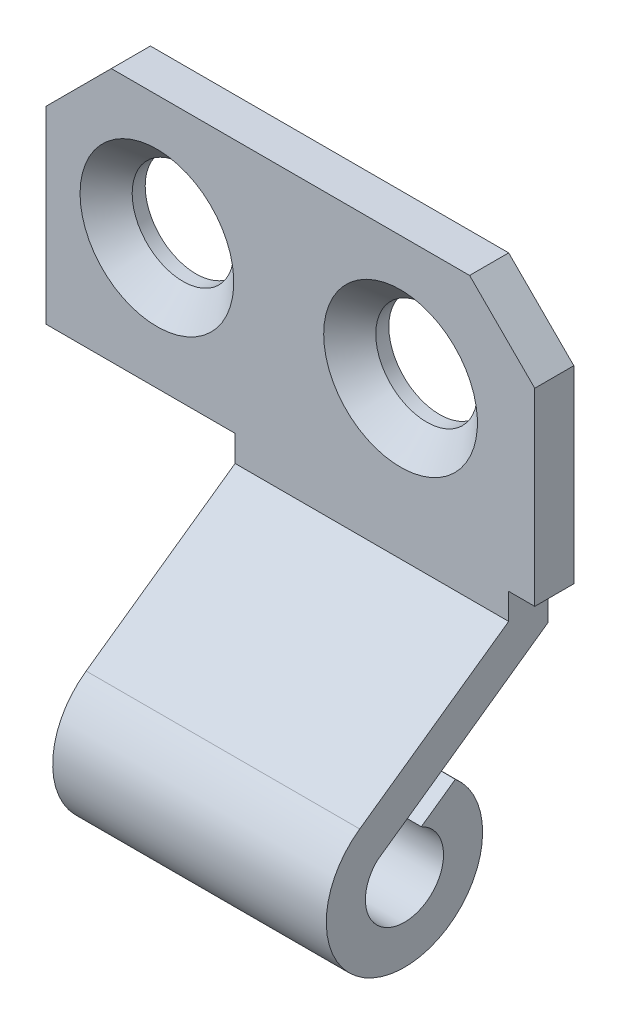
ISO-10303-21;
HEADER;
FILE_DESCRIPTION(('STEP AP214'),'2;1');
FILE_NAME('part.step','',(''),(''),'','','');
FILE_SCHEMA(('AUTOMOTIVE_DESIGN { 1 0 10303 214 1 1 1 1 }'));
ENDSEC;
DATA;
#1=APPLICATION_CONTEXT('core data for automotive mechanical design processes');
#2=APPLICATION_PROTOCOL_DEFINITION('international standard','automotive_design',2000,#1);
#3=PRODUCT_CONTEXT('',#1,'mechanical');
#4=PRODUCT('Part','Part','',(#3));
#5=PRODUCT_RELATED_PRODUCT_CATEGORY('part','',(#4));
#6=PRODUCT_DEFINITION_FORMATION('','',#4);
#7=PRODUCT_DEFINITION_CONTEXT('part definition',#1,'design');
#8=PRODUCT_DEFINITION('design','',#6,#7);
#9=PRODUCT_DEFINITION_SHAPE('','',#8);
#10=(LENGTH_UNIT() NAMED_UNIT(*) SI_UNIT(.MILLI.,.METRE.));
#11=(NAMED_UNIT(*) PLANE_ANGLE_UNIT() SI_UNIT($,.RADIAN.));
#12=(NAMED_UNIT(*) SI_UNIT($,.STERADIAN.) SOLID_ANGLE_UNIT());
#13=UNCERTAINTY_MEASURE_WITH_UNIT(LENGTH_MEASURE(1.E-05),#10,'distance_accuracy_value','');
#14=(GEOMETRIC_REPRESENTATION_CONTEXT(3) GLOBAL_UNCERTAINTY_ASSIGNED_CONTEXT((#13)) GLOBAL_UNIT_ASSIGNED_CONTEXT((#10,
#11,#12)) REPRESENTATION_CONTEXT('',''));
#15=CARTESIAN_POINT('',(0.,0.,0.));
#16=DIRECTION('',(0.,0.,1.));
#17=DIRECTION('',(1.,0.,0.));
#18=AXIS2_PLACEMENT_3D('',#15,#16,#17);
#19=CARTESIAN_POINT('',(0.,0.,3.));
#20=DIRECTION('',(0.,0.,-1.));
#21=DIRECTION('',(-1.,0.,0.));
#22=AXIS2_PLACEMENT_3D('',#19,#20,#21);
#23=PLANE('',#22);
#24=CARTESIAN_POINT('',(-10.25,0.25,3.));
#25=DIRECTION('',(0.,0.,-1.));
#26=DIRECTION('',(-1.,0.,0.));
#27=AXIS2_PLACEMENT_3D('',#24,#25,#26);
#28=CIRCLE('',#27,5.90000000000001);
#29=CARTESIAN_POINT('',(-16.15,0.25,3.));
#30=VERTEX_POINT('',#29);
#31=EDGE_CURVE('E42',#30,#30,#28,.T.);
#32=ORIENTED_EDGE('',*,*,#31,.T.);
#33=EDGE_LOOP('',(#32));
#34=FACE_BOUND('',#33,.T.);
#35=CARTESIAN_POINT('',(8.45,0.25,3.));
#36=DIRECTION('',(0.,0.,-1.));
#37=DIRECTION('',(-1.,0.,0.));
#38=AXIS2_PLACEMENT_3D('',#35,#36,#37);
#39=CIRCLE('',#38,5.90000000000001);
#40=CARTESIAN_POINT('',(2.54999999999999,0.25,3.));
#41=VERTEX_POINT('',#40);
#42=EDGE_CURVE('E231',#41,#41,#39,.T.);
#43=ORIENTED_EDGE('',*,*,#42,.T.);
#44=EDGE_LOOP('',(#43));
#45=FACE_BOUND('',#44,.T.);
#46=DIRECTION('',(1.,0.,0.));
#47=VECTOR('',#46,1.);
#48=CARTESIAN_POINT('',(16.75,-9.75,3.));
#49=LINE('',#48,#47);
#50=CARTESIAN_POINT('',(16.75,-9.75,3.));
#51=VERTEX_POINT('',#50);
#52=CARTESIAN_POINT('',(18.75,-9.75,3.));
#53=VERTEX_POINT('',#52);
#54=EDGE_CURVE('E179',#51,#53,#49,.T.);
#55=ORIENTED_EDGE('',*,*,#54,.T.);
#56=DIRECTION('',(0.,1.,0.));
#57=VECTOR('',#56,1.);
#58=CARTESIAN_POINT('',(18.75,4.75,3.));
#59=LINE('',#58,#57);
#60=CARTESIAN_POINT('',(18.75,4.75,3.));
#61=VERTEX_POINT('',#60);
#62=EDGE_CURVE('E96',#53,#61,#59,.T.);
#63=ORIENTED_EDGE('',*,*,#62,.T.);
#64=DIRECTION('',(-0.707106781186548,0.707106781186547,0.));
#65=VECTOR('',#64,1.);
#66=CARTESIAN_POINT('',(13.75,9.75,3.));
#67=LINE('',#66,#65);
#68=CARTESIAN_POINT('',(13.75,9.75,3.));
#69=VERTEX_POINT('',#68);
#70=EDGE_CURVE('E182',#61,#69,#67,.T.);
#71=ORIENTED_EDGE('',*,*,#70,.T.);
#72=DIRECTION('',(-1.,0.,0.));
#73=VECTOR('',#72,1.);
#74=CARTESIAN_POINT('',(-13.75,9.75,3.));
#75=LINE('',#74,#73);
#76=CARTESIAN_POINT('',(-13.75,9.75,3.));
#77=VERTEX_POINT('',#76);
#78=EDGE_CURVE('E184',#69,#77,#75,.T.);
#79=ORIENTED_EDGE('',*,*,#78,.T.);
#80=DIRECTION('',(-0.707106781186548,-0.707106781186547,0.));
#81=VECTOR('',#80,1.);
#82=CARTESIAN_POINT('',(-13.75,9.75,3.));
#83=LINE('',#82,#81);
#84=CARTESIAN_POINT('',(-18.75,4.75,3.));
#85=VERTEX_POINT('',#84);
#86=EDGE_CURVE('E186',#77,#85,#83,.T.);
#87=ORIENTED_EDGE('',*,*,#86,.T.);
#88=DIRECTION('',(0.,-1.,0.));
#89=VECTOR('',#88,1.);
#90=CARTESIAN_POINT('',(-18.75,4.75,3.));
#91=LINE('',#90,#89);
#92=CARTESIAN_POINT('',(-18.75,-9.75,3.));
#93=VERTEX_POINT('',#92);
#94=EDGE_CURVE('E188',#85,#93,#91,.T.);
#95=ORIENTED_EDGE('',*,*,#94,.T.);
#96=DIRECTION('',(1.,0.,0.));
#97=VECTOR('',#96,1.);
#98=CARTESIAN_POINT('',(-18.75,-9.75,3.));
#99=LINE('',#98,#97);
#100=CARTESIAN_POINT('',(-4.25,-9.75,3.));
#101=VERTEX_POINT('',#100);
#102=EDGE_CURVE('E121',#93,#101,#99,.T.);
#103=ORIENTED_EDGE('',*,*,#102,.T.);
#104=DIRECTION('',(0.,-1.,0.));
#105=VECTOR('',#104,1.);
#106=CARTESIAN_POINT('',(-4.25,-9.75,3.));
#107=LINE('',#106,#105);
#108=CARTESIAN_POINT('',(-4.25,-11.75,3.));
#109=VERTEX_POINT('',#108);
#110=EDGE_CURVE('E117',#101,#109,#107,.T.);
#111=ORIENTED_EDGE('',*,*,#110,.T.);
#112=DIRECTION('',(1.,0.,0.));
#113=VECTOR('',#112,1.);
#114=CARTESIAN_POINT('',(-4.25,-11.75,3.));
#115=LINE('',#114,#113);
#116=CARTESIAN_POINT('',(16.75,-11.75,3.));
#117=VERTEX_POINT('',#116);
#118=EDGE_CURVE('E119',#109,#117,#115,.T.);
#119=ORIENTED_EDGE('',*,*,#118,.T.);
#120=DIRECTION('',(0.,1.,0.));
#121=VECTOR('',#120,1.);
#122=CARTESIAN_POINT('',(16.75,-9.75,3.));
#123=LINE('',#122,#121);
#124=EDGE_CURVE('E50',#117,#51,#123,.T.);
#125=ORIENTED_EDGE('',*,*,#124,.T.);
#126=EDGE_LOOP('',(#55,#63,#71,#79,#87,#95,#103,#111,#119,#125));
#127=FACE_BOUND('',#126,.T.);
#128=ADVANCED_FACE('F33',(#34,#45,#127),#23,.F.);
#129=CARTESIAN_POINT('',(0.,0.,0.));
#130=DIRECTION('',(0.,0.,-1.));
#131=DIRECTION('',(-1.,0.,0.));
#132=AXIS2_PLACEMENT_3D('',#129,#130,#131);
#133=PLANE('',#132);
#134=CARTESIAN_POINT('',(8.45,0.25,0.));
#135=DIRECTION('',(0.,0.,1.));
#136=DIRECTION('',(1.,0.,0.));
#137=AXIS2_PLACEMENT_3D('',#134,#135,#136);
#138=CIRCLE('',#137,3.9);
#139=CARTESIAN_POINT('',(12.35,0.25,0.));
#140=VERTEX_POINT('',#139);
#141=EDGE_CURVE('E175',#140,#140,#138,.T.);
#142=ORIENTED_EDGE('',*,*,#141,.T.);
#143=EDGE_LOOP('',(#142));
#144=FACE_BOUND('',#143,.T.);
#145=DIRECTION('',(1.,0.,0.));
#146=VECTOR('',#145,1.);
#147=CARTESIAN_POINT('',(16.75,-9.75,0.));
#148=LINE('',#147,#146);
#149=CARTESIAN_POINT('',(16.75,-9.75,0.));
#150=VERTEX_POINT('',#149);
#151=CARTESIAN_POINT('',(18.75,-9.75,0.));
#152=VERTEX_POINT('',#151);
#153=EDGE_CURVE('E178',#150,#152,#148,.T.);
#154=ORIENTED_EDGE('',*,*,#153,.F.);
#155=DIRECTION('',(0.,1.,0.));
#156=VECTOR('',#155,1.);
#157=CARTESIAN_POINT('',(16.75,-9.75,0.));
#158=LINE('',#157,#156);
#159=CARTESIAN_POINT('',(16.75,-13.3486434125533,0.));
#160=VERTEX_POINT('',#159);
#161=EDGE_CURVE('E87',#160,#150,#158,.T.);
#162=ORIENTED_EDGE('',*,*,#161,.F.);
#163=DIRECTION('',(1.,0.,0.));
#164=VECTOR('',#163,1.);
#165=CARTESIAN_POINT('',(-4.25,-13.3486434125533,0.));
#166=LINE('',#165,#164);
#167=CARTESIAN_POINT('',(-4.25,-13.3486434125533,0.));
#168=VERTEX_POINT('',#167);
#169=EDGE_CURVE('E159',#168,#160,#166,.T.);
#170=ORIENTED_EDGE('',*,*,#169,.F.);
#171=DIRECTION('',(0.,-1.,0.));
#172=VECTOR('',#171,1.);
#173=CARTESIAN_POINT('',(-4.25,-9.75,0.));
#174=LINE('',#173,#172);
#175=CARTESIAN_POINT('',(-4.25,-9.75,0.));
#176=VERTEX_POINT('',#175);
#177=EDGE_CURVE('E206',#176,#168,#174,.T.);
#178=ORIENTED_EDGE('',*,*,#177,.F.);
#179=DIRECTION('',(1.,0.,0.));
#180=VECTOR('',#179,1.);
#181=CARTESIAN_POINT('',(-18.75,-9.75,0.));
#182=LINE('',#181,#180);
#183=CARTESIAN_POINT('',(-18.75,-9.75,0.));
#184=VERTEX_POINT('',#183);
#185=EDGE_CURVE('E80',#184,#176,#182,.T.);
#186=ORIENTED_EDGE('',*,*,#185,.F.);
#187=DIRECTION('',(0.,-1.,0.));
#188=VECTOR('',#187,1.);
#189=CARTESIAN_POINT('',(-18.75,4.75,0.));
#190=LINE('',#189,#188);
#191=CARTESIAN_POINT('',(-18.75,4.75,0.));
#192=VERTEX_POINT('',#191);
#193=EDGE_CURVE('E203',#192,#184,#190,.T.);
#194=ORIENTED_EDGE('',*,*,#193,.F.);
#195=DIRECTION('',(-0.707106781186548,-0.707106781186547,0.));
#196=VECTOR('',#195,1.);
#197=CARTESIAN_POINT('',(-13.75,9.75,0.));
#198=LINE('',#197,#196);
#199=CARTESIAN_POINT('',(-13.75,9.75,0.));
#200=VERTEX_POINT('',#199);
#201=EDGE_CURVE('E201',#200,#192,#198,.T.);
#202=ORIENTED_EDGE('',*,*,#201,.F.);
#203=DIRECTION('',(-1.,0.,0.));
#204=VECTOR('',#203,1.);
#205=CARTESIAN_POINT('',(-13.75,9.75,0.));
#206=LINE('',#205,#204);
#207=CARTESIAN_POINT('',(13.75,9.75,0.));
#208=VERTEX_POINT('',#207);
#209=EDGE_CURVE('E199',#208,#200,#206,.T.);
#210=ORIENTED_EDGE('',*,*,#209,.F.);
#211=DIRECTION('',(-0.707106781186548,0.707106781186547,0.));
#212=VECTOR('',#211,1.);
#213=CARTESIAN_POINT('',(13.75,9.75,0.));
#214=LINE('',#213,#212);
#215=CARTESIAN_POINT('',(18.75,4.75,0.));
#216=VERTEX_POINT('',#215);
#217=EDGE_CURVE('E197',#216,#208,#214,.T.);
#218=ORIENTED_EDGE('',*,*,#217,.F.);
#219=DIRECTION('',(0.,1.,0.));
#220=VECTOR('',#219,1.);
#221=CARTESIAN_POINT('',(18.75,4.75,0.));
#222=LINE('',#221,#220);
#223=EDGE_CURVE('E195',#152,#216,#222,.T.);
#224=ORIENTED_EDGE('',*,*,#223,.F.);
#225=EDGE_LOOP('',(#154,#162,#170,#178,#186,#194,#202,#210,#218,#224));
#226=FACE_BOUND('',#225,.T.);
#227=CARTESIAN_POINT('',(-10.25,0.25,0.));
#228=DIRECTION('',(0.,0.,1.));
#229=DIRECTION('',(1.,0.,0.));
#230=AXIS2_PLACEMENT_3D('',#227,#228,#229);
#231=CIRCLE('',#230,3.9);
#232=CARTESIAN_POINT('',(-6.34999999999999,0.25,0.));
#233=VERTEX_POINT('',#232);
#234=EDGE_CURVE('E162',#233,#233,#231,.T.);
#235=ORIENTED_EDGE('',*,*,#234,.T.);
#236=EDGE_LOOP('',(#235));
#237=FACE_BOUND('',#236,.T.);
#238=ADVANCED_FACE('F250',(#144,#226,#237),#133,.T.);
#239=CARTESIAN_POINT('',(16.75,-9.75,3.));
#240=DIRECTION('',(0.,1.,0.));
#241=DIRECTION('',(0.,0.,1.));
#242=AXIS2_PLACEMENT_3D('',#239,#240,#241);
#243=PLANE('',#242);
#244=ORIENTED_EDGE('',*,*,#153,.T.);
#245=DIRECTION('',(0.,0.,-1.));
#246=VECTOR('',#245,1.);
#247=CARTESIAN_POINT('',(18.75,-9.75,3.));
#248=LINE('',#247,#246);
#249=EDGE_CURVE('E226',#53,#152,#248,.T.);
#250=ORIENTED_EDGE('',*,*,#249,.F.);
#251=ORIENTED_EDGE('',*,*,#54,.F.);
#252=DIRECTION('',(0.,0.,-1.));
#253=VECTOR('',#252,1.);
#254=CARTESIAN_POINT('',(16.75,-9.75,3.));
#255=LINE('',#254,#253);
#256=EDGE_CURVE('E192',#51,#150,#255,.T.);
#257=ORIENTED_EDGE('',*,*,#256,.T.);
#258=EDGE_LOOP('',(#244,#250,#251,#257));
#259=FACE_BOUND('',#258,.T.);
#260=ADVANCED_FACE('F252',(#259),#243,.F.);
#261=CARTESIAN_POINT('',(18.75,4.75,3.));
#262=DIRECTION('',(-1.,0.,0.));
#263=DIRECTION('',(0.,-1.,0.));
#264=AXIS2_PLACEMENT_3D('',#261,#262,#263);
#265=PLANE('',#264);
#266=ORIENTED_EDGE('',*,*,#223,.T.);
#267=DIRECTION('',(0.,0.,-1.));
#268=VECTOR('',#267,1.);
#269=CARTESIAN_POINT('',(18.75,4.75,3.));
#270=LINE('',#269,#268);
#271=EDGE_CURVE('E223',#61,#216,#270,.T.);
#272=ORIENTED_EDGE('',*,*,#271,.F.);
#273=ORIENTED_EDGE('',*,*,#62,.F.);
#274=ORIENTED_EDGE('',*,*,#249,.T.);
#275=EDGE_LOOP('',(#266,#272,#273,#274));
#276=FACE_BOUND('',#275,.T.);
#277=ADVANCED_FACE('F259',(#276),#265,.F.);
#278=CARTESIAN_POINT('',(13.75,9.75,3.));
#279=DIRECTION('',(-0.707106781186547,-0.707106781186548,0.));
#280=DIRECTION('',(0.707106781186548,-0.707106781186547,0.));
#281=AXIS2_PLACEMENT_3D('',#278,#279,#280);
#282=PLANE('',#281);
#283=ORIENTED_EDGE('',*,*,#217,.T.);
#284=DIRECTION('',(0.,0.,-1.));
#285=VECTOR('',#284,1.);
#286=CARTESIAN_POINT('',(13.75,9.75,3.));
#287=LINE('',#286,#285);
#288=EDGE_CURVE('E220',#69,#208,#287,.T.);
#289=ORIENTED_EDGE('',*,*,#288,.F.);
#290=ORIENTED_EDGE('',*,*,#70,.F.);
#291=ORIENTED_EDGE('',*,*,#271,.T.);
#292=EDGE_LOOP('',(#283,#289,#290,#291));
#293=FACE_BOUND('',#292,.T.);
#294=ADVANCED_FACE('F285',(#293),#282,.F.);
#295=CARTESIAN_POINT('',(-13.75,9.75,3.));
#296=DIRECTION('',(0.,-1.,0.));
#297=DIRECTION('',(0.,0.,-1.));
#298=AXIS2_PLACEMENT_3D('',#295,#296,#297);
#299=PLANE('',#298);
#300=ORIENTED_EDGE('',*,*,#209,.T.);
#301=DIRECTION('',(0.,0.,-1.));
#302=VECTOR('',#301,1.);
#303=CARTESIAN_POINT('',(-13.75,9.75,3.));
#304=LINE('',#303,#302);
#305=EDGE_CURVE('E217',#77,#200,#304,.T.);
#306=ORIENTED_EDGE('',*,*,#305,.F.);
#307=ORIENTED_EDGE('',*,*,#78,.F.);
#308=ORIENTED_EDGE('',*,*,#288,.T.);
#309=EDGE_LOOP('',(#300,#306,#307,#308));
#310=FACE_BOUND('',#309,.T.);
#311=ADVANCED_FACE('F281',(#310),#299,.F.);
#312=CARTESIAN_POINT('',(-13.75,9.75,3.));
#313=DIRECTION('',(0.707106781186547,-0.707106781186548,0.));
#314=DIRECTION('',(0.707106781186548,0.707106781186547,0.));
#315=AXIS2_PLACEMENT_3D('',#312,#313,#314);
#316=PLANE('',#315);
#317=ORIENTED_EDGE('',*,*,#201,.T.);
#318=DIRECTION('',(0.,0.,-1.));
#319=VECTOR('',#318,1.);
#320=CARTESIAN_POINT('',(-18.75,4.75,3.));
#321=LINE('',#320,#319);
#322=EDGE_CURVE('E214',#85,#192,#321,.T.);
#323=ORIENTED_EDGE('',*,*,#322,.F.);
#324=ORIENTED_EDGE('',*,*,#86,.F.);
#325=ORIENTED_EDGE('',*,*,#305,.T.);
#326=EDGE_LOOP('',(#317,#323,#324,#325));
#327=FACE_BOUND('',#326,.T.);
#328=ADVANCED_FACE('F277',(#327),#316,.F.);
#329=CARTESIAN_POINT('',(-18.75,4.75,3.));
#330=DIRECTION('',(1.,0.,0.));
#331=DIRECTION('',(0.,1.,0.));
#332=AXIS2_PLACEMENT_3D('',#329,#330,#331);
#333=PLANE('',#332);
#334=ORIENTED_EDGE('',*,*,#193,.T.);
#335=DIRECTION('',(0.,0.,-1.));
#336=VECTOR('',#335,1.);
#337=CARTESIAN_POINT('',(-18.75,-9.75,3.));
#338=LINE('',#337,#336);
#339=EDGE_CURVE('E212',#93,#184,#338,.T.);
#340=ORIENTED_EDGE('',*,*,#339,.F.);
#341=ORIENTED_EDGE('',*,*,#94,.F.);
#342=ORIENTED_EDGE('',*,*,#322,.T.);
#343=EDGE_LOOP('',(#334,#340,#341,#342));
#344=FACE_BOUND('',#343,.T.);
#345=ADVANCED_FACE('F274',(#344),#333,.F.);
#346=CARTESIAN_POINT('',(-18.75,-9.75,3.));
#347=DIRECTION('',(0.,1.,0.));
#348=DIRECTION('',(0.,0.,1.));
#349=AXIS2_PLACEMENT_3D('',#346,#347,#348);
#350=PLANE('',#349);
#351=ORIENTED_EDGE('',*,*,#185,.T.);
#352=DIRECTION('',(0.,0.,-1.));
#353=VECTOR('',#352,1.);
#354=CARTESIAN_POINT('',(-4.25,-9.75,3.));
#355=LINE('',#354,#353);
#356=EDGE_CURVE('E210',#101,#176,#355,.T.);
#357=ORIENTED_EDGE('',*,*,#356,.F.);
#358=ORIENTED_EDGE('',*,*,#102,.F.);
#359=ORIENTED_EDGE('',*,*,#339,.T.);
#360=EDGE_LOOP('',(#351,#357,#358,#359));
#361=FACE_BOUND('',#360,.T.);
#362=ADVANCED_FACE('F271',(#361),#350,.F.);
#363=CARTESIAN_POINT('',(-4.25,-9.75,3.));
#364=DIRECTION('',(1.,0.,0.));
#365=DIRECTION('',(0.,0.,-1.));
#366=AXIS2_PLACEMENT_3D('',#363,#364,#365);
#367=PLANE('',#366);
#368=ORIENTED_EDGE('',*,*,#177,.T.);
#369=DIRECTION('',(0.,-0.57710358824873,0.8166709548101));
#370=VECTOR('',#369,1.);
#371=CARTESIAN_POINT('',(-4.25,-13.3486434125533,0.));
#372=LINE('',#371,#370);
#373=CARTESIAN_POINT('',(-4.25,-22.6012003334332,13.0934803540903));
#374=VERTEX_POINT('',#373);
#375=EDGE_CURVE('E155',#168,#374,#372,.T.);
#376=ORIENTED_EDGE('',*,*,#375,.T.);
#377=CARTESIAN_POINT('',(-4.25,-24.75,11.));
#378=DIRECTION('',(1.,0.,0.));
#379=DIRECTION('',(0.,0.,-1.));
#380=AXIS2_PLACEMENT_3D('',#377,#378,#379);
#381=CIRCLE('',#380,3.);
#382=CARTESIAN_POINT('',(-4.25,-22.0437157622179,9.70538591683386));
#383=VERTEX_POINT('',#382);
#384=EDGE_CURVE('E152',#374,#383,#381,.T.);
#385=ORIENTED_EDGE('',*,*,#384,.T.);
#386=DIRECTION('',(0.,-0.57710358824873,0.8166709548101));
#387=VECTOR('',#386,1.);
#388=CARTESIAN_POINT('',(-4.25,-20.1970890298532,7.09218709532849));
#389=LINE('',#388,#387);
#390=CARTESIAN_POINT('',(-4.25,-20.1970890298532,7.09218709532849));
#391=VERTEX_POINT('',#390);
#392=EDGE_CURVE('E143',#391,#383,#389,.T.);
#393=ORIENTED_EDGE('',*,*,#392,.F.);
#394=CARTESIAN_POINT('',(-4.25,-24.75,11.));
#395=DIRECTION('',(1.,0.,0.));
#396=DIRECTION('',(0.,0.,-1.));
#397=AXIS2_PLACEMENT_3D('',#394,#395,#396);
#398=CIRCLE('',#397,6.);
#399=CARTESIAN_POINT('',(-4.25,-19.8294502354822,14.4333933673414));
#400=VERTEX_POINT('',#399);
#401=EDGE_CURVE('E140',#400,#391,#398,.T.);
#402=ORIENTED_EDGE('',*,*,#401,.F.);
#403=DIRECTION('',(0.,-0.57710358824873,0.8166709548101));
#404=VECTOR('',#403,1.);
#405=CARTESIAN_POINT('',(-4.25,-11.75,3.));
#406=LINE('',#405,#404);
#407=EDGE_CURVE('E131',#109,#400,#406,.T.);
#408=ORIENTED_EDGE('',*,*,#407,.F.);
#409=ORIENTED_EDGE('',*,*,#110,.F.);
#410=ORIENTED_EDGE('',*,*,#356,.T.);
#411=EDGE_LOOP('',(#368,#376,#385,#393,#402,#408,#409,#410));
#412=FACE_BOUND('',#411,.T.);
#413=ADVANCED_FACE('F137',(#412),#367,.F.);
#414=CARTESIAN_POINT('',(16.75,-9.75,3.));
#415=DIRECTION('',(-1.,0.,0.));
#416=DIRECTION('',(0.,0.,1.));
#417=AXIS2_PLACEMENT_3D('',#414,#415,#416);
#418=PLANE('',#417);
#419=ORIENTED_EDGE('',*,*,#161,.T.);
#420=ORIENTED_EDGE('',*,*,#256,.F.);
#421=ORIENTED_EDGE('',*,*,#124,.F.);
#422=DIRECTION('',(0.,-0.57710358824873,0.8166709548101));
#423=VECTOR('',#422,1.);
#424=CARTESIAN_POINT('',(16.75,-11.75,3.));
#425=LINE('',#424,#423);
#426=CARTESIAN_POINT('',(16.75,-19.8294502354822,14.4333933673414));
#427=VERTEX_POINT('',#426);
#428=EDGE_CURVE('E133',#117,#427,#425,.T.);
#429=ORIENTED_EDGE('',*,*,#428,.T.);
#430=CARTESIAN_POINT('',(16.75,-24.75,11.));
#431=DIRECTION('',(1.,0.,0.));
#432=DIRECTION('',(0.,0.,-1.));
#433=AXIS2_PLACEMENT_3D('',#430,#431,#432);
#434=CIRCLE('',#433,6.);
#435=CARTESIAN_POINT('',(16.75,-20.1970890298532,7.09218709532849));
#436=VERTEX_POINT('',#435);
#437=EDGE_CURVE('E327',#427,#436,#434,.T.);
#438=ORIENTED_EDGE('',*,*,#437,.T.);
#439=DIRECTION('',(0.,-0.57710358824873,0.8166709548101));
#440=VECTOR('',#439,1.);
#441=CARTESIAN_POINT('',(16.75,-20.1970890298532,7.09218709532849));
#442=LINE('',#441,#440);
#443=CARTESIAN_POINT('',(16.75,-22.0437157622179,9.70538591683386));
#444=VERTEX_POINT('',#443);
#445=EDGE_CURVE('E323',#436,#444,#442,.T.);
#446=ORIENTED_EDGE('',*,*,#445,.T.);
#447=CARTESIAN_POINT('',(16.75,-24.75,11.));
#448=DIRECTION('',(1.,0.,0.));
#449=DIRECTION('',(0.,0.,-1.));
#450=AXIS2_PLACEMENT_3D('',#447,#448,#449);
#451=CIRCLE('',#450,3.);
#452=CARTESIAN_POINT('',(16.75,-22.6012003334332,13.0934803540903));
#453=VERTEX_POINT('',#452);
#454=EDGE_CURVE('E146',#453,#444,#451,.T.);
#455=ORIENTED_EDGE('',*,*,#454,.F.);
#456=DIRECTION('',(0.,-0.57710358824873,0.8166709548101));
#457=VECTOR('',#456,1.);
#458=CARTESIAN_POINT('',(16.75,-13.3486434125533,0.));
#459=LINE('',#458,#457);
#460=EDGE_CURVE('E141',#160,#453,#459,.T.);
#461=ORIENTED_EDGE('',*,*,#460,.F.);
#462=EDGE_LOOP('',(#419,#420,#421,#429,#438,#446,#455,#461));
#463=FACE_BOUND('',#462,.T.);
#464=ADVANCED_FACE('F266',(#463),#418,.F.);
#465=CARTESIAN_POINT('',(8.45,0.25,3.));
#466=DIRECTION('',(0.,0.,-1.));
#467=DIRECTION('',(-1.,0.,0.));
#468=AXIS2_PLACEMENT_3D('',#465,#466,#467);
#469=CYLINDRICAL_SURFACE('',#468,3.9);
#470=CARTESIAN_POINT('',(8.45,0.25,1.00000000000001));
#471=DIRECTION('',(0.,0.,-1.));
#472=DIRECTION('',(-1.,0.,0.));
#473=AXIS2_PLACEMENT_3D('',#470,#471,#472);
#474=CIRCLE('',#473,3.9);
#475=CARTESIAN_POINT('',(4.55,0.25,1.00000000000001));
#476=VERTEX_POINT('',#475);
#477=EDGE_CURVE('E11',#476,#476,#474,.F.);
#478=ORIENTED_EDGE('',*,*,#477,.T.);
#479=EDGE_LOOP('',(#478));
#480=FACE_BOUND('',#479,.T.);
#481=ORIENTED_EDGE('',*,*,#141,.F.);
#482=EDGE_LOOP('',(#481));
#483=FACE_BOUND('',#482,.T.);
#484=ADVANCED_FACE('F246',(#480,#483),#469,.F.);
#485=CARTESIAN_POINT('',(-10.25,0.25,3.));
#486=DIRECTION('',(0.,0.,-1.));
#487=DIRECTION('',(-1.,0.,0.));
#488=AXIS2_PLACEMENT_3D('',#485,#486,#487);
#489=CYLINDRICAL_SURFACE('',#488,3.9);
#490=CARTESIAN_POINT('',(-10.25,0.25,1.00000000000001));
#491=DIRECTION('',(0.,0.,-1.));
#492=DIRECTION('',(-1.,0.,0.));
#493=AXIS2_PLACEMENT_3D('',#490,#491,#492);
#494=CIRCLE('',#493,3.9);
#495=CARTESIAN_POINT('',(-14.15,0.25,1.00000000000001));
#496=VERTEX_POINT('',#495);
#497=EDGE_CURVE('E228',#496,#496,#494,.F.);
#498=ORIENTED_EDGE('',*,*,#497,.T.);
#499=EDGE_LOOP('',(#498));
#500=FACE_BOUND('',#499,.T.);
#501=ORIENTED_EDGE('',*,*,#234,.F.);
#502=EDGE_LOOP('',(#501));
#503=FACE_BOUND('',#502,.T.);
#504=ADVANCED_FACE('F241',(#500,#503),#489,.F.);
#505=CARTESIAN_POINT('',(-10.25,0.25,1.00000000000001));
#506=DIRECTION('',(0.,0.,1.));
#507=DIRECTION('',(1.,0.,0.));
#508=AXIS2_PLACEMENT_3D('',#505,#506,#507);
#509=CONICAL_SURFACE('',#508,3.9,0.785398163397452);
#510=ORIENTED_EDGE('',*,*,#31,.F.);
#511=EDGE_LOOP('',(#510));
#512=FACE_BOUND('',#511,.T.);
#513=ORIENTED_EDGE('',*,*,#497,.F.);
#514=EDGE_LOOP('',(#513));
#515=FACE_BOUND('',#514,.T.);
#516=ADVANCED_FACE('F238',(#512,#515),#509,.F.);
#517=CARTESIAN_POINT('',(8.45,0.25,1.00000000000001));
#518=DIRECTION('',(0.,0.,1.));
#519=DIRECTION('',(1.,0.,0.));
#520=AXIS2_PLACEMENT_3D('',#517,#518,#519);
#521=CONICAL_SURFACE('',#520,3.9,0.785398163397452);
#522=ORIENTED_EDGE('',*,*,#42,.F.);
#523=EDGE_LOOP('',(#522));
#524=FACE_BOUND('',#523,.T.);
#525=ORIENTED_EDGE('',*,*,#477,.F.);
#526=EDGE_LOOP('',(#525));
#527=FACE_BOUND('',#526,.T.);
#528=ADVANCED_FACE('F35',(#524,#527),#521,.F.);
#529=CARTESIAN_POINT('',(-4.25,-11.75,3.));
#530=DIRECTION('',(0.,0.8166709548101,0.57710358824873));
#531=DIRECTION('',(0.,-0.57710358824873,0.8166709548101));
#532=AXIS2_PLACEMENT_3D('',#529,#530,#531);
#533=PLANE('',#532);
#534=DIRECTION('',(1.,0.,0.));
#535=VECTOR('',#534,1.);
#536=CARTESIAN_POINT('',(-4.25,-19.8294502354822,14.4333933673414));
#537=LINE('',#536,#535);
#538=EDGE_CURVE('E158',#400,#427,#537,.T.);
#539=ORIENTED_EDGE('',*,*,#538,.T.);
#540=ORIENTED_EDGE('',*,*,#428,.F.);
#541=ORIENTED_EDGE('',*,*,#118,.F.);
#542=ORIENTED_EDGE('',*,*,#407,.T.);
#543=EDGE_LOOP('',(#539,#540,#541,#542));
#544=FACE_BOUND('',#543,.T.);
#545=ADVANCED_FACE('F129',(#544),#533,.T.);
#546=CARTESIAN_POINT('',(-4.25,-13.3486434125533,0.));
#547=DIRECTION('',(0.,0.8166709548101,0.57710358824873));
#548=DIRECTION('',(0.,-0.57710358824873,0.8166709548101));
#549=AXIS2_PLACEMENT_3D('',#546,#547,#548);
#550=PLANE('',#549);
#551=ORIENTED_EDGE('',*,*,#169,.T.);
#552=ORIENTED_EDGE('',*,*,#460,.T.);
#553=DIRECTION('',(1.,0.,0.));
#554=VECTOR('',#553,1.);
#555=CARTESIAN_POINT('',(-4.25,-22.6012003334332,13.0934803540903));
#556=LINE('',#555,#554);
#557=EDGE_CURVE('E163',#374,#453,#556,.T.);
#558=ORIENTED_EDGE('',*,*,#557,.F.);
#559=ORIENTED_EDGE('',*,*,#375,.F.);
#560=EDGE_LOOP('',(#551,#552,#558,#559));
#561=FACE_BOUND('',#560,.T.);
#562=ADVANCED_FACE('F315',(#561),#550,.F.);
#563=CARTESIAN_POINT('',(-4.25,-24.75,11.));
#564=DIRECTION('',(1.,0.,0.));
#565=DIRECTION('',(0.,0.,-1.));
#566=AXIS2_PLACEMENT_3D('',#563,#564,#565);
#567=CYLINDRICAL_SURFACE('',#566,3.);
#568=ORIENTED_EDGE('',*,*,#557,.T.);
#569=ORIENTED_EDGE('',*,*,#454,.T.);
#570=DIRECTION('',(1.,0.,0.));
#571=VECTOR('',#570,1.);
#572=CARTESIAN_POINT('',(-4.25,-22.0437157622179,9.70538591683386));
#573=LINE('',#572,#571);
#574=EDGE_CURVE('E166',#383,#444,#573,.T.);
#575=ORIENTED_EDGE('',*,*,#574,.F.);
#576=ORIENTED_EDGE('',*,*,#384,.F.);
#577=EDGE_LOOP('',(#568,#569,#575,#576));
#578=FACE_BOUND('',#577,.T.);
#579=ADVANCED_FACE('F346',(#578),#567,.F.);
#580=CARTESIAN_POINT('',(-4.25,-20.1970890298532,7.09218709532849));
#581=DIRECTION('',(0.,0.8166709548101,0.57710358824873));
#582=DIRECTION('',(0.,-0.57710358824873,0.8166709548101));
#583=AXIS2_PLACEMENT_3D('',#580,#581,#582);
#584=PLANE('',#583);
#585=ORIENTED_EDGE('',*,*,#574,.T.);
#586=ORIENTED_EDGE('',*,*,#445,.F.);
#587=DIRECTION('',(1.,0.,0.));
#588=VECTOR('',#587,1.);
#589=CARTESIAN_POINT('',(-4.25,-20.1970890298532,7.09218709532849));
#590=LINE('',#589,#588);
#591=EDGE_CURVE('E169',#391,#436,#590,.T.);
#592=ORIENTED_EDGE('',*,*,#591,.F.);
#593=ORIENTED_EDGE('',*,*,#392,.T.);
#594=EDGE_LOOP('',(#585,#586,#592,#593));
#595=FACE_BOUND('',#594,.T.);
#596=ADVANCED_FACE('F348',(#595),#584,.T.);
#597=CARTESIAN_POINT('',(-4.25,-24.75,11.));
#598=DIRECTION('',(1.,0.,0.));
#599=DIRECTION('',(0.,0.,-1.));
#600=AXIS2_PLACEMENT_3D('',#597,#598,#599);
#601=CYLINDRICAL_SURFACE('',#600,6.);
#602=ORIENTED_EDGE('',*,*,#591,.T.);
#603=ORIENTED_EDGE('',*,*,#437,.F.);
#604=ORIENTED_EDGE('',*,*,#538,.F.);
#605=ORIENTED_EDGE('',*,*,#401,.T.);
#606=EDGE_LOOP('',(#602,#603,#604,#605));
#607=FACE_BOUND('',#606,.T.);
#608=ADVANCED_FACE('F350',(#607),#601,.T.);
#609=CLOSED_SHELL('',(#128,#238,#260,#277,#294,#311,#328,#345,#362,#413,#464,#484,#504,#516,
#528,#545,#562,#579,#596,#608));
#610=MANIFOLD_SOLID_BREP('B2',#609);
#611=ADVANCED_BREP_SHAPE_REPRESENTATION('',(#18,#610),#14);
#612=SHAPE_DEFINITION_REPRESENTATION(#9,#611);
ENDSEC;
END-ISO-10303-21;
